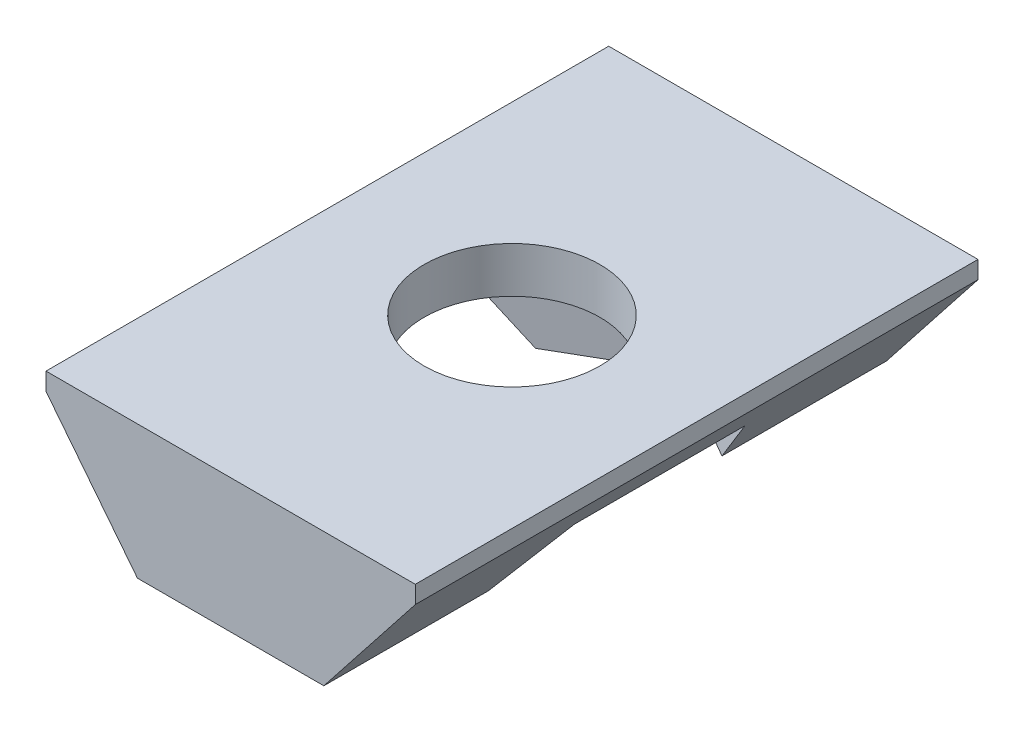
ISO-10303-21;
HEADER;
FILE_DESCRIPTION(('STEP AP214'),'2;1');
FILE_NAME('part.step','',(''),(''),'','','');
FILE_SCHEMA(('AUTOMOTIVE_DESIGN { 1 0 10303 214 1 1 1 1 }'));
ENDSEC;
DATA;
#1=APPLICATION_CONTEXT('core data for automotive mechanical design processes');
#2=APPLICATION_PROTOCOL_DEFINITION('international standard','automotive_design',2000,#1);
#3=PRODUCT_CONTEXT('',#1,'mechanical');
#4=PRODUCT('Part','Part','',(#3));
#5=PRODUCT_RELATED_PRODUCT_CATEGORY('part','',(#4));
#6=PRODUCT_DEFINITION_FORMATION('','',#4);
#7=PRODUCT_DEFINITION_CONTEXT('part definition',#1,'design');
#8=PRODUCT_DEFINITION('design','',#6,#7);
#9=PRODUCT_DEFINITION_SHAPE('','',#8);
#10=(LENGTH_UNIT() NAMED_UNIT(*) SI_UNIT(.MILLI.,.METRE.));
#11=(NAMED_UNIT(*) PLANE_ANGLE_UNIT() SI_UNIT($,.RADIAN.));
#12=(NAMED_UNIT(*) SI_UNIT($,.STERADIAN.) SOLID_ANGLE_UNIT());
#13=UNCERTAINTY_MEASURE_WITH_UNIT(LENGTH_MEASURE(1.E-05),#10,'distance_accuracy_value','');
#14=(GEOMETRIC_REPRESENTATION_CONTEXT(3) GLOBAL_UNCERTAINTY_ASSIGNED_CONTEXT((#13)) GLOBAL_UNIT_ASSIGNED_CONTEXT((#10,
#11,#12)) REPRESENTATION_CONTEXT('',''));
#15=CARTESIAN_POINT('',(0.,0.,0.));
#16=DIRECTION('',(0.,0.,1.));
#17=DIRECTION('',(1.,0.,0.));
#18=AXIS2_PLACEMENT_3D('',#15,#16,#17);
#19=CARTESIAN_POINT('',(-2.65,0.,16.));
#20=DIRECTION('',(0.,1.,0.));
#21=DIRECTION('',(-1.,0.,0.));
#22=AXIS2_PLACEMENT_3D('',#19,#20,#21);
#23=PLANE('',#22);
#24=DIRECTION('',(0.,0.,-1.));
#25=VECTOR('',#24,1.);
#26=CARTESIAN_POINT('',(2.65,0.,16.));
#27=LINE('',#26,#25);
#28=CARTESIAN_POINT('',(2.65,0.,4.68023595215965));
#29=VERTEX_POINT('',#28);
#30=CARTESIAN_POINT('',(2.65,0.,0.));
#31=VERTEX_POINT('',#30);
#32=EDGE_CURVE('E148',#29,#31,#27,.T.);
#33=ORIENTED_EDGE('',*,*,#32,.F.);
#34=DIRECTION('',(0.866025403784439,0.,0.5));
#35=VECTOR('',#34,1.);
#36=CARTESIAN_POINT('',(0.,0.,3.15025773880714));
#37=LINE('',#36,#35);
#38=CARTESIAN_POINT('',(0.,0.,3.15025773880714));
#39=VERTEX_POINT('',#38);
#40=EDGE_CURVE('E49',#39,#29,#37,.T.);
#41=ORIENTED_EDGE('',*,*,#40,.F.);
#42=DIRECTION('',(0.866025403784439,0.,-0.5));
#43=VECTOR('',#42,1.);
#44=CARTESIAN_POINT('',(-4.2,0.,5.57512886940357));
#45=LINE('',#44,#43);
#46=CARTESIAN_POINT('',(-2.65,0.,4.68023595215965));
#47=VERTEX_POINT('',#46);
#48=EDGE_CURVE('E196',#47,#39,#45,.T.);
#49=ORIENTED_EDGE('',*,*,#48,.F.);
#50=DIRECTION('',(0.,0.,-1.));
#51=VECTOR('',#50,1.);
#52=CARTESIAN_POINT('',(-2.65,0.,16.));
#53=LINE('',#52,#51);
#54=CARTESIAN_POINT('',(-2.65,0.,0.));
#55=VERTEX_POINT('',#54);
#56=EDGE_CURVE('E152',#47,#55,#53,.T.);
#57=ORIENTED_EDGE('',*,*,#56,.T.);
#58=DIRECTION('',(1.,0.,0.));
#59=VECTOR('',#58,1.);
#60=CARTESIAN_POINT('',(-2.65,0.,0.));
#61=LINE('',#60,#59);
#62=EDGE_CURVE('E134',#55,#31,#61,.T.);
#63=ORIENTED_EDGE('',*,*,#62,.T.);
#64=EDGE_LOOP('',(#33,#41,#49,#57,#63));
#65=FACE_BOUND('',#64,.T.);
#66=ADVANCED_FACE('F34',(#65),#23,.F.);
#67=CARTESIAN_POINT('',(0.,0.,8.));
#68=DIRECTION('',(0.,1.,0.));
#69=DIRECTION('',(0.,0.,1.));
#70=AXIS2_PLACEMENT_3D('',#67,#68,#69);
#71=CYLINDRICAL_SURFACE('',#70,2.5);
#72=CARTESIAN_POINT('',(0.,3.8,8.));
#73=DIRECTION('',(0.,-1.,0.));
#74=DIRECTION('',(0.,0.,-1.));
#75=AXIS2_PLACEMENT_3D('',#72,#73,#74);
#76=CIRCLE('',#75,2.5);
#77=CARTESIAN_POINT('',(0.,3.8,10.5));
#78=VERTEX_POINT('',#77);
#79=EDGE_CURVE('E135',#78,#78,#76,.T.);
#80=CARTESIAN_POINT('',(0.,2.5,8.));
#81=DIRECTION('',(0.,-1.,0.));
#82=DIRECTION('',(1.,0.,0.));
#83=AXIS2_PLACEMENT_3D('',#80,#81,#82);
#84=CIRCLE('',#83,2.5);
#85=CARTESIAN_POINT('',(0.,2.5,10.5));
#86=VERTEX_POINT('',#85);
#87=EDGE_CURVE('E159',#86,#86,#84,.F.);
#88=CARTESIAN_POINT('',(0.,3.8,10.5));
#89=CARTESIAN_POINT('',(0.,3.78645833333333,10.5));
#90=CARTESIAN_POINT('',(0.,3.77291666666667,10.5));
#91=CARTESIAN_POINT('',(0.,3.74583333333333,10.5));
#92=CARTESIAN_POINT('',(0.,3.73229166666667,10.5));
#93=CARTESIAN_POINT('',(0.,3.70520833333333,10.5));
#94=CARTESIAN_POINT('',(0.,3.69166666666667,10.5));
#95=CARTESIAN_POINT('',(0.,3.66458333333333,10.5));
#96=CARTESIAN_POINT('',(0.,3.65104166666667,10.5));
#97=CARTESIAN_POINT('',(0.,3.62395833333333,10.5));
#98=CARTESIAN_POINT('',(0.,3.61041666666667,10.5));
#99=CARTESIAN_POINT('',(0.,3.58333333333333,10.5));
#100=CARTESIAN_POINT('',(0.,3.56979166666667,10.5));
#101=CARTESIAN_POINT('',(0.,3.54270833333333,10.5));
#102=CARTESIAN_POINT('',(0.,3.52916666666667,10.5));
#103=CARTESIAN_POINT('',(0.,3.50208333333333,10.5));
#104=CARTESIAN_POINT('',(0.,3.48854166666667,10.5));
#105=CARTESIAN_POINT('',(0.,3.46145833333333,10.5));
#106=CARTESIAN_POINT('',(0.,3.44791666666667,10.5));
#107=CARTESIAN_POINT('',(0.,3.42083333333333,10.5));
#108=CARTESIAN_POINT('',(0.,3.40729166666667,10.5));
#109=CARTESIAN_POINT('',(0.,3.38020833333333,10.5));
#110=CARTESIAN_POINT('',(0.,3.36666666666667,10.5));
#111=CARTESIAN_POINT('',(0.,3.33958333333333,10.5));
#112=CARTESIAN_POINT('',(0.,3.32604166666667,10.5));
#113=CARTESIAN_POINT('',(0.,3.29895833333333,10.5));
#114=CARTESIAN_POINT('',(0.,3.28541666666667,10.5));
#115=CARTESIAN_POINT('',(0.,3.25833333333333,10.5));
#116=CARTESIAN_POINT('',(0.,3.24479166666667,10.5));
#117=CARTESIAN_POINT('',(0.,3.21770833333333,10.5));
#118=CARTESIAN_POINT('',(0.,3.20416666666667,10.5));
#119=CARTESIAN_POINT('',(0.,3.17708333333333,10.5));
#120=CARTESIAN_POINT('',(0.,3.16354166666667,10.5));
#121=CARTESIAN_POINT('',(0.,3.13645833333333,10.5));
#122=CARTESIAN_POINT('',(0.,3.12291666666667,10.5));
#123=CARTESIAN_POINT('',(0.,3.09583333333333,10.5));
#124=CARTESIAN_POINT('',(0.,3.08229166666667,10.5));
#125=CARTESIAN_POINT('',(0.,3.05520833333333,10.5));
#126=CARTESIAN_POINT('',(0.,3.04166666666667,10.5));
#127=CARTESIAN_POINT('',(0.,3.01458333333333,10.5));
#128=CARTESIAN_POINT('',(0.,3.00104166666667,10.5));
#129=CARTESIAN_POINT('',(0.,2.97395833333333,10.5));
#130=CARTESIAN_POINT('',(0.,2.96041666666667,10.5));
#131=CARTESIAN_POINT('',(0.,2.93333333333333,10.5));
#132=CARTESIAN_POINT('',(0.,2.91979166666667,10.5));
#133=CARTESIAN_POINT('',(0.,2.89270833333333,10.5));
#134=CARTESIAN_POINT('',(0.,2.87916666666667,10.5));
#135=CARTESIAN_POINT('',(0.,2.85208333333333,10.5));
#136=CARTESIAN_POINT('',(0.,2.83854166666667,10.5));
#137=CARTESIAN_POINT('',(0.,2.81145833333333,10.5));
#138=CARTESIAN_POINT('',(0.,2.79791666666667,10.5));
#139=CARTESIAN_POINT('',(0.,2.77083333333333,10.5));
#140=CARTESIAN_POINT('',(0.,2.75729166666667,10.5));
#141=CARTESIAN_POINT('',(0.,2.73020833333333,10.5));
#142=CARTESIAN_POINT('',(0.,2.71666666666667,10.5));
#143=CARTESIAN_POINT('',(0.,2.68958333333333,10.5));
#144=CARTESIAN_POINT('',(0.,2.67604166666667,10.5));
#145=CARTESIAN_POINT('',(0.,2.64895833333333,10.5));
#146=CARTESIAN_POINT('',(0.,2.63541666666667,10.5));
#147=CARTESIAN_POINT('',(0.,2.60833333333333,10.5));
#148=CARTESIAN_POINT('',(0.,2.59479166666667,10.5));
#149=CARTESIAN_POINT('',(0.,2.56770833333333,10.5));
#150=CARTESIAN_POINT('',(0.,2.55416666666667,10.5));
#151=CARTESIAN_POINT('',(0.,2.52708333333333,10.5));
#152=CARTESIAN_POINT('',(0.,2.51354166666667,10.5));
#153=CARTESIAN_POINT('',(0.,2.5,10.5));
#154=B_SPLINE_CURVE_WITH_KNOTS('',3,(#88,#89,#90,#91,#92,#93,#94,#95,#96,#97,#98,#99,#100,#101,
#102,#103,#104,#105,#106,#107,#108,#109,#110,#111,#112,#113,#114,#115,#116,#117,#118,#119,#120,
#121,#122,#123,#124,#125,#126,#127,#128,#129,#130,#131,#132,#133,#134,#135,#136,#137,#138,#139,
#140,#141,#142,#143,#144,#145,#146,#147,#148,#149,#150,#151,#152,#153),.UNSPECIFIED.,.F.,.F.,(4,
2,2,2,2,2,2,2,2,2,2,2,2,2,2,2,2,2,2,2,2,2,2,2,2,2,2,2,2,2,2,2,4),(0.,0.0406249999999999,
0.0812500000000002,0.121875,0.1625,0.203125,0.24375,0.284375,0.325,0.365625,0.40625,0.446875,
0.4875,0.528125,0.56875,0.609375,0.65,0.690625,0.73125,0.771875,0.8125,0.853125,0.89375,
0.934375,0.975,1.015625,1.05625,1.096875,1.1375,1.178125,1.21875,1.259375,1.3),.UNSPECIFIED.);
#155=EDGE_CURVE('BSEAM303',#78,#86,#154,.T.);
#156=ORIENTED_EDGE('',*,*,#79,.F.);
#157=ORIENTED_EDGE('',*,*,#87,.F.);
#158=ORIENTED_EDGE('',*,*,#155,.T.);
#159=ORIENTED_EDGE('',*,*,#155,.F.);
#160=EDGE_LOOP('',(#156,#158,#157,#159));
#161=FACE_BOUND('',#160,.T.);
#162=ADVANCED_FACE('F303',(#161),#71,.F.);
#163=CARTESIAN_POINT('',(-2.65,0.,16.));
#164=DIRECTION('',(0.785491672227536,0.618872226603513,0.));
#165=DIRECTION('',(-0.618872226603513,0.785491672227536,0.));
#166=AXIS2_PLACEMENT_3D('',#163,#164,#165);
#167=PLANE('',#166);
#168=ORIENTED_EDGE('',*,*,#56,.F.);
#169=DIRECTION('',(-0.582787783907528,0.739692187267247,0.336472683919436));
#170=VECTOR('',#169,1.);
#171=CARTESIAN_POINT('',(-4.86971709384232,2.81733323449217,5.96179021381433));
#172=LINE('',#171,#170);
#173=CARTESIAN_POINT('',(-4.2,1.96730769230769,5.57512886940357));
#174=VERTEX_POINT('',#173);
#175=EDGE_CURVE('E158',#47,#174,#172,.T.);
#176=ORIENTED_EDGE('',*,*,#175,.T.);
#177=DIRECTION('',(0.,0.,1.));
#178=VECTOR('',#177,1.);
#179=CARTESIAN_POINT('',(-4.2,1.96730769230769,16.));
#180=LINE('',#179,#178);
#181=CARTESIAN_POINT('',(-4.2,1.96730769230769,10.4248711305964));
#182=VERTEX_POINT('',#181);
#183=EDGE_CURVE('E11',#174,#182,#180,.T.);
#184=ORIENTED_EDGE('',*,*,#183,.T.);
#185=DIRECTION('',(0.582787783907528,-0.739692187267247,0.336472683919437));
#186=VECTOR('',#185,1.);
#187=CARTESIAN_POINT('',(-1.7322423769331,-1.16484621389261,11.8496316585689));
#188=LINE('',#187,#186);
#189=CARTESIAN_POINT('',(-2.65,0.,11.3197640478403));
#190=VERTEX_POINT('',#189);
#191=EDGE_CURVE('E162',#182,#190,#188,.T.);
#192=ORIENTED_EDGE('',*,*,#191,.T.);
#193=CARTESIAN_POINT('',(-2.65,0.,16.));
#194=VERTEX_POINT('',#193);
#195=EDGE_CURVE('E153',#194,#190,#53,.T.);
#196=ORIENTED_EDGE('',*,*,#195,.F.);
#197=DIRECTION('',(0.618872226603513,-0.785491672227536,0.));
#198=VECTOR('',#197,1.);
#199=CARTESIAN_POINT('',(-2.65,0.,16.));
#200=LINE('',#199,#198);
#201=CARTESIAN_POINT('',(-5.25,3.3,16.));
#202=VERTEX_POINT('',#201);
#203=EDGE_CURVE('E144',#202,#194,#200,.T.);
#204=ORIENTED_EDGE('',*,*,#203,.F.);
#205=DIRECTION('',(0.,0.,-1.));
#206=VECTOR('',#205,1.);
#207=CARTESIAN_POINT('',(-5.25,3.3,16.));
#208=LINE('',#207,#206);
#209=CARTESIAN_POINT('',(-5.25,3.3,0.));
#210=VERTEX_POINT('',#209);
#211=EDGE_CURVE('E127',#202,#210,#208,.T.);
#212=ORIENTED_EDGE('',*,*,#211,.T.);
#213=DIRECTION('',(0.618872226603513,-0.785491672227536,0.));
#214=VECTOR('',#213,1.);
#215=CARTESIAN_POINT('',(-2.65,0.,0.));
#216=LINE('',#215,#214);
#217=EDGE_CURVE('E131',#210,#55,#216,.T.);
#218=ORIENTED_EDGE('',*,*,#217,.T.);
#219=EDGE_LOOP('',(#168,#176,#184,#192,#196,#204,#212,#218));
#220=FACE_BOUND('',#219,.T.);
#221=ADVANCED_FACE('F36',(#220),#167,.F.);
#222=DIRECTION('',(-0.866025403784438,0.,-0.5));
#223=VECTOR('',#222,1.);
#224=CARTESIAN_POINT('',(0.,0.,12.8497422611929));
#225=LINE('',#224,#223);
#226=CARTESIAN_POINT('',(0.,0.,12.8497422611929));
#227=VERTEX_POINT('',#226);
#228=EDGE_CURVE('E194',#227,#190,#225,.T.);
#229=ORIENTED_EDGE('',*,*,#228,.F.);
#230=DIRECTION('',(-0.866025403784439,0.,0.5));
#231=VECTOR('',#230,1.);
#232=CARTESIAN_POINT('',(4.2,0.,10.4248711305964));
#233=LINE('',#232,#231);
#234=CARTESIAN_POINT('',(2.65,0.,11.3197640478404));
#235=VERTEX_POINT('',#234);
#236=EDGE_CURVE('E184',#235,#227,#233,.T.);
#237=ORIENTED_EDGE('',*,*,#236,.F.);
#238=CARTESIAN_POINT('',(2.65,0.,16.));
#239=VERTEX_POINT('',#238);
#240=EDGE_CURVE('E149',#239,#235,#27,.T.);
#241=ORIENTED_EDGE('',*,*,#240,.F.);
#242=DIRECTION('',(1.,0.,0.));
#243=VECTOR('',#242,1.);
#244=CARTESIAN_POINT('',(-2.65,0.,16.));
#245=LINE('',#244,#243);
#246=EDGE_CURVE('E94',#194,#239,#245,.T.);
#247=ORIENTED_EDGE('',*,*,#246,.F.);
#248=ORIENTED_EDGE('',*,*,#195,.T.);
#249=EDGE_LOOP('',(#229,#237,#241,#247,#248));
#250=FACE_BOUND('',#249,.T.);
#251=ADVANCED_FACE('F192',(#250),#23,.F.);
#252=CARTESIAN_POINT('',(5.25,3.3,16.));
#253=DIRECTION('',(-0.785491672227536,0.618872226603513,0.));
#254=DIRECTION('',(-0.618872226603513,-0.785491672227535,0.));
#255=AXIS2_PLACEMENT_3D('',#252,#253,#254);
#256=PLANE('',#255);
#257=ORIENTED_EDGE('',*,*,#240,.T.);
#258=DIRECTION('',(0.582787783907528,0.739692187267247,-0.336472683919437));
#259=VECTOR('',#258,1.);
#260=CARTESIAN_POINT('',(4.03788632267083,1.76154802492836,10.5184675058417));
#261=LINE('',#260,#259);
#262=CARTESIAN_POINT('',(4.2,1.96730769230769,10.4248711305964));
#263=VERTEX_POINT('',#262);
#264=EDGE_CURVE('E42',#235,#263,#261,.T.);
#265=ORIENTED_EDGE('',*,*,#264,.T.);
#266=DIRECTION('',(0.,0.,-1.));
#267=VECTOR('',#266,1.);
#268=CARTESIAN_POINT('',(4.2,1.96730769230769,16.));
#269=LINE('',#268,#267);
#270=CARTESIAN_POINT('',(4.2,1.96730769230769,5.57512886940358));
#271=VERTEX_POINT('',#270);
#272=EDGE_CURVE('E165',#263,#271,#269,.T.);
#273=ORIENTED_EDGE('',*,*,#272,.T.);
#274=DIRECTION('',(-0.582787783907528,-0.739692187267247,-0.336472683919437));
#275=VECTOR('',#274,1.);
#276=CARTESIAN_POINT('',(7.17536103958005,5.74372747331314,7.29295436654145));
#277=LINE('',#276,#275);
#278=EDGE_CURVE('E155',#271,#29,#277,.T.);
#279=ORIENTED_EDGE('',*,*,#278,.T.);
#280=ORIENTED_EDGE('',*,*,#32,.T.);
#281=DIRECTION('',(0.618872226603513,0.785491672227535,0.));
#282=VECTOR('',#281,1.);
#283=CARTESIAN_POINT('',(5.25,3.3,0.));
#284=LINE('',#283,#282);
#285=CARTESIAN_POINT('',(5.25,3.3,0.));
#286=VERTEX_POINT('',#285);
#287=EDGE_CURVE('E138',#31,#286,#284,.T.);
#288=ORIENTED_EDGE('',*,*,#287,.T.);
#289=DIRECTION('',(0.,0.,-1.));
#290=VECTOR('',#289,1.);
#291=CARTESIAN_POINT('',(5.25,3.3,16.));
#292=LINE('',#291,#290);
#293=CARTESIAN_POINT('',(5.25,3.3,16.));
#294=VERTEX_POINT('',#293);
#295=EDGE_CURVE('E122',#294,#286,#292,.T.);
#296=ORIENTED_EDGE('',*,*,#295,.F.);
#297=DIRECTION('',(0.618872226603513,0.785491672227535,0.));
#298=VECTOR('',#297,1.);
#299=CARTESIAN_POINT('',(5.25,3.3,16.));
#300=LINE('',#299,#298);
#301=EDGE_CURVE('E110',#239,#294,#300,.T.);
#302=ORIENTED_EDGE('',*,*,#301,.F.);
#303=EDGE_LOOP('',(#257,#265,#273,#279,#280,#288,#296,#302));
#304=FACE_BOUND('',#303,.T.);
#305=ADVANCED_FACE('F171',(#304),#256,.F.);
#306=CARTESIAN_POINT('',(5.25,3.3,16.));
#307=DIRECTION('',(-1.,0.,0.));
#308=DIRECTION('',(0.,-1.,0.));
#309=AXIS2_PLACEMENT_3D('',#306,#307,#308);
#310=PLANE('',#309);
#311=DIRECTION('',(0.,1.,0.));
#312=VECTOR('',#311,1.);
#313=CARTESIAN_POINT('',(5.25,3.3,0.));
#314=LINE('',#313,#312);
#315=CARTESIAN_POINT('',(5.25,3.8,0.));
#316=VERTEX_POINT('',#315);
#317=EDGE_CURVE('E119',#286,#316,#314,.T.);
#318=ORIENTED_EDGE('',*,*,#317,.T.);
#319=DIRECTION('',(0.,0.,-1.));
#320=VECTOR('',#319,1.);
#321=CARTESIAN_POINT('',(5.25,3.8,16.));
#322=LINE('',#321,#320);
#323=CARTESIAN_POINT('',(5.25,3.8,16.));
#324=VERTEX_POINT('',#323);
#325=EDGE_CURVE('E116',#324,#316,#322,.T.);
#326=ORIENTED_EDGE('',*,*,#325,.F.);
#327=DIRECTION('',(0.,1.,0.));
#328=VECTOR('',#327,1.);
#329=CARTESIAN_POINT('',(5.25,3.3,16.));
#330=LINE('',#329,#328);
#331=EDGE_CURVE('E103',#294,#324,#330,.T.);
#332=ORIENTED_EDGE('',*,*,#331,.F.);
#333=ORIENTED_EDGE('',*,*,#295,.T.);
#334=EDGE_LOOP('',(#318,#326,#332,#333));
#335=FACE_BOUND('',#334,.T.);
#336=ADVANCED_FACE('F117',(#335),#310,.F.);
#337=CARTESIAN_POINT('',(-5.25,3.8,16.));
#338=DIRECTION('',(0.,-1.,0.));
#339=DIRECTION('',(0.,0.,-1.));
#340=AXIS2_PLACEMENT_3D('',#337,#338,#339);
#341=PLANE('',#340);
#342=ORIENTED_EDGE('',*,*,#79,.T.);
#343=EDGE_LOOP('',(#342));
#344=FACE_BOUND('',#343,.T.);
#345=DIRECTION('',(-1.,0.,0.));
#346=VECTOR('',#345,1.);
#347=CARTESIAN_POINT('',(-5.25,3.8,0.));
#348=LINE('',#347,#346);
#349=CARTESIAN_POINT('',(-5.25,3.8,0.));
#350=VERTEX_POINT('',#349);
#351=EDGE_CURVE('E141',#316,#350,#348,.T.);
#352=ORIENTED_EDGE('',*,*,#351,.T.);
#353=DIRECTION('',(0.,0.,-1.));
#354=VECTOR('',#353,1.);
#355=CARTESIAN_POINT('',(-5.25,3.8,16.));
#356=LINE('',#355,#354);
#357=CARTESIAN_POINT('',(-5.25,3.8,16.));
#358=VERTEX_POINT('',#357);
#359=EDGE_CURVE('E123',#358,#350,#356,.T.);
#360=ORIENTED_EDGE('',*,*,#359,.F.);
#361=DIRECTION('',(-1.,0.,0.));
#362=VECTOR('',#361,1.);
#363=CARTESIAN_POINT('',(-5.25,3.8,16.));
#364=LINE('',#363,#362);
#365=EDGE_CURVE('E107',#324,#358,#364,.T.);
#366=ORIENTED_EDGE('',*,*,#365,.F.);
#367=ORIENTED_EDGE('',*,*,#325,.T.);
#368=EDGE_LOOP('',(#352,#360,#366,#367));
#369=FACE_BOUND('',#368,.T.);
#370=ADVANCED_FACE('F125',(#344,#369),#341,.F.);
#371=CARTESIAN_POINT('',(-5.25,3.3,16.));
#372=DIRECTION('',(1.,0.,0.));
#373=DIRECTION('',(0.,1.,0.));
#374=AXIS2_PLACEMENT_3D('',#371,#372,#373);
#375=PLANE('',#374);
#376=DIRECTION('',(0.,-1.,0.));
#377=VECTOR('',#376,1.);
#378=CARTESIAN_POINT('',(-5.25,3.3,0.));
#379=LINE('',#378,#377);
#380=EDGE_CURVE('E85',#350,#210,#379,.T.);
#381=ORIENTED_EDGE('',*,*,#380,.T.);
#382=ORIENTED_EDGE('',*,*,#211,.F.);
#383=DIRECTION('',(0.,-1.,0.));
#384=VECTOR('',#383,1.);
#385=CARTESIAN_POINT('',(-5.25,3.3,16.));
#386=LINE('',#385,#384);
#387=EDGE_CURVE('E58',#358,#202,#386,.T.);
#388=ORIENTED_EDGE('',*,*,#387,.F.);
#389=ORIENTED_EDGE('',*,*,#359,.T.);
#390=EDGE_LOOP('',(#381,#382,#388,#389));
#391=FACE_BOUND('',#390,.T.);
#392=ADVANCED_FACE('F336',(#391),#375,.F.);
#393=CARTESIAN_POINT('',(0.,0.,16.));
#394=DIRECTION('',(0.,0.,1.));
#395=DIRECTION('',(1.,0.,0.));
#396=AXIS2_PLACEMENT_3D('',#393,#394,#395);
#397=PLANE('',#396);
#398=ORIENTED_EDGE('',*,*,#203,.T.);
#399=ORIENTED_EDGE('',*,*,#246,.T.);
#400=ORIENTED_EDGE('',*,*,#301,.T.);
#401=ORIENTED_EDGE('',*,*,#331,.T.);
#402=ORIENTED_EDGE('',*,*,#365,.T.);
#403=ORIENTED_EDGE('',*,*,#387,.T.);
#404=EDGE_LOOP('',(#398,#399,#400,#401,#402,#403));
#405=FACE_BOUND('',#404,.T.);
#406=ADVANCED_FACE('F105',(#405),#397,.T.);
#407=CARTESIAN_POINT('',(0.,0.,0.));
#408=DIRECTION('',(0.,0.,1.));
#409=DIRECTION('',(1.,0.,0.));
#410=AXIS2_PLACEMENT_3D('',#407,#408,#409);
#411=PLANE('',#410);
#412=ORIENTED_EDGE('',*,*,#217,.F.);
#413=ORIENTED_EDGE('',*,*,#380,.F.);
#414=ORIENTED_EDGE('',*,*,#351,.F.);
#415=ORIENTED_EDGE('',*,*,#317,.F.);
#416=ORIENTED_EDGE('',*,*,#287,.F.);
#417=ORIENTED_EDGE('',*,*,#62,.F.);
#418=EDGE_LOOP('',(#412,#413,#414,#415,#416,#417));
#419=FACE_BOUND('',#418,.T.);
#420=ADVANCED_FACE('F258',(#419),#411,.F.);
#421=CARTESIAN_POINT('',(-4.2,2.5,10.4248711305964));
#422=DIRECTION('',(-1.,0.,0.));
#423=DIRECTION('',(0.,-1.,0.));
#424=AXIS2_PLACEMENT_3D('',#421,#422,#423);
#425=PLANE('',#424);
#426=DIRECTION('',(0.,-1.,0.));
#427=VECTOR('',#426,1.);
#428=CARTESIAN_POINT('',(-4.2,2.5,5.57512886940357));
#429=LINE('',#428,#427);
#430=CARTESIAN_POINT('',(-4.2,2.5,5.57512886940357));
#431=VERTEX_POINT('',#430);
#432=EDGE_CURVE('E212',#431,#174,#429,.T.);
#433=ORIENTED_EDGE('',*,*,#432,.F.);
#434=DIRECTION('',(0.,0.,-1.));
#435=VECTOR('',#434,1.);
#436=CARTESIAN_POINT('',(-4.2,2.5,10.4248711305964));
#437=LINE('',#436,#435);
#438=CARTESIAN_POINT('',(-4.2,2.5,10.4248711305964));
#439=VERTEX_POINT('',#438);
#440=EDGE_CURVE('E277',#439,#431,#437,.T.);
#441=ORIENTED_EDGE('',*,*,#440,.F.);
#442=DIRECTION('',(0.,-1.,0.));
#443=VECTOR('',#442,1.);
#444=CARTESIAN_POINT('',(-4.2,2.5,10.4248711305964));
#445=LINE('',#444,#443);
#446=EDGE_CURVE('E215',#439,#182,#445,.T.);
#447=ORIENTED_EDGE('',*,*,#446,.T.);
#448=ORIENTED_EDGE('',*,*,#183,.F.);
#449=EDGE_LOOP('',(#433,#441,#447,#448));
#450=FACE_BOUND('',#449,.T.);
#451=ADVANCED_FACE('F241',(#450),#425,.F.);
#452=CARTESIAN_POINT('',(-4.2,2.5,5.57512886940357));
#453=DIRECTION('',(-0.5,0.,-0.866025403784439));
#454=DIRECTION('',(-0.866025403784439,0.,0.5));
#455=AXIS2_PLACEMENT_3D('',#452,#453,#454);
#456=PLANE('',#455);
#457=ORIENTED_EDGE('',*,*,#48,.T.);
#458=DIRECTION('',(0.,-1.,0.));
#459=VECTOR('',#458,1.);
#460=CARTESIAN_POINT('',(0.,2.5,3.15025773880714));
#461=LINE('',#460,#459);
#462=CARTESIAN_POINT('',(0.,2.5,3.15025773880714));
#463=VERTEX_POINT('',#462);
#464=EDGE_CURVE('E210',#463,#39,#461,.T.);
#465=ORIENTED_EDGE('',*,*,#464,.F.);
#466=DIRECTION('',(0.866025403784439,0.,-0.5));
#467=VECTOR('',#466,1.);
#468=CARTESIAN_POINT('',(-4.2,2.5,5.57512886940357));
#469=LINE('',#468,#467);
#470=EDGE_CURVE('E250',#431,#463,#469,.T.);
#471=ORIENTED_EDGE('',*,*,#470,.F.);
#472=ORIENTED_EDGE('',*,*,#432,.T.);
#473=ORIENTED_EDGE('',*,*,#175,.F.);
#474=EDGE_LOOP('',(#457,#465,#471,#472,#473));
#475=FACE_BOUND('',#474,.T.);
#476=ADVANCED_FACE('F246',(#475),#456,.F.);
#477=CARTESIAN_POINT('',(0.,2.5,12.8497422611929));
#478=DIRECTION('',(-0.5,0.,0.866025403784438));
#479=DIRECTION('',(0.866025403784439,0.,0.5));
#480=AXIS2_PLACEMENT_3D('',#477,#478,#479);
#481=PLANE('',#480);
#482=ORIENTED_EDGE('',*,*,#446,.F.);
#483=DIRECTION('',(-0.866025403784438,0.,-0.5));
#484=VECTOR('',#483,1.);
#485=CARTESIAN_POINT('',(0.,2.5,12.8497422611929));
#486=LINE('',#485,#484);
#487=CARTESIAN_POINT('',(0.,2.5,12.8497422611929));
#488=VERTEX_POINT('',#487);
#489=EDGE_CURVE('E275',#488,#439,#486,.T.);
#490=ORIENTED_EDGE('',*,*,#489,.F.);
#491=DIRECTION('',(0.,-1.,0.));
#492=VECTOR('',#491,1.);
#493=CARTESIAN_POINT('',(0.,2.5,12.8497422611929));
#494=LINE('',#493,#492);
#495=EDGE_CURVE('E218',#488,#227,#494,.T.);
#496=ORIENTED_EDGE('',*,*,#495,.T.);
#497=ORIENTED_EDGE('',*,*,#228,.T.);
#498=ORIENTED_EDGE('',*,*,#191,.F.);
#499=EDGE_LOOP('',(#482,#490,#496,#497,#498));
#500=FACE_BOUND('',#499,.T.);
#501=ADVANCED_FACE('F273',(#500),#481,.F.);
#502=CARTESIAN_POINT('',(4.2,2.5,10.4248711305964));
#503=DIRECTION('',(0.5,0.,0.866025403784439));
#504=DIRECTION('',(0.866025403784439,0.,-0.5));
#505=AXIS2_PLACEMENT_3D('',#502,#503,#504);
#506=PLANE('',#505);
#507=ORIENTED_EDGE('',*,*,#236,.T.);
#508=ORIENTED_EDGE('',*,*,#495,.F.);
#509=DIRECTION('',(-0.866025403784439,0.,0.5));
#510=VECTOR('',#509,1.);
#511=CARTESIAN_POINT('',(4.2,2.5,10.4248711305964));
#512=LINE('',#511,#510);
#513=CARTESIAN_POINT('',(4.2,2.5,10.4248711305964));
#514=VERTEX_POINT('',#513);
#515=EDGE_CURVE('E205',#514,#488,#512,.T.);
#516=ORIENTED_EDGE('',*,*,#515,.F.);
#517=DIRECTION('',(0.,-1.,0.));
#518=VECTOR('',#517,1.);
#519=CARTESIAN_POINT('',(4.2,2.5,10.4248711305964));
#520=LINE('',#519,#518);
#521=EDGE_CURVE('E163',#514,#263,#520,.T.);
#522=ORIENTED_EDGE('',*,*,#521,.T.);
#523=ORIENTED_EDGE('',*,*,#264,.F.);
#524=EDGE_LOOP('',(#507,#508,#516,#522,#523));
#525=FACE_BOUND('',#524,.T.);
#526=ADVANCED_FACE('F181',(#525),#506,.F.);
#527=CARTESIAN_POINT('',(4.2,2.5,5.57512886940357));
#528=DIRECTION('',(1.,0.,0.));
#529=DIRECTION('',(0.,0.,-1.));
#530=AXIS2_PLACEMENT_3D('',#527,#528,#529);
#531=PLANE('',#530);
#532=ORIENTED_EDGE('',*,*,#521,.F.);
#533=DIRECTION('',(0.,0.,1.));
#534=VECTOR('',#533,1.);
#535=CARTESIAN_POINT('',(4.2,2.5,5.57512886940357));
#536=LINE('',#535,#534);
#537=CARTESIAN_POINT('',(4.2,2.5,5.57512886940357));
#538=VERTEX_POINT('',#537);
#539=EDGE_CURVE('E199',#538,#514,#536,.T.);
#540=ORIENTED_EDGE('',*,*,#539,.F.);
#541=DIRECTION('',(0.,-1.,0.));
#542=VECTOR('',#541,1.);
#543=CARTESIAN_POINT('',(4.2,2.5,5.57512886940357));
#544=LINE('',#543,#542);
#545=EDGE_CURVE('E207',#538,#271,#544,.T.);
#546=ORIENTED_EDGE('',*,*,#545,.T.);
#547=ORIENTED_EDGE('',*,*,#272,.F.);
#548=EDGE_LOOP('',(#532,#540,#546,#547));
#549=FACE_BOUND('',#548,.T.);
#550=ADVANCED_FACE('F291',(#549),#531,.F.);
#551=CARTESIAN_POINT('',(0.,2.5,3.15025773880714));
#552=DIRECTION('',(0.5,0.,-0.866025403784438));
#553=DIRECTION('',(-0.866025403784438,0.,-0.5));
#554=AXIS2_PLACEMENT_3D('',#551,#552,#553);
#555=PLANE('',#554);
#556=ORIENTED_EDGE('',*,*,#545,.F.);
#557=DIRECTION('',(0.866025403784439,0.,0.5));
#558=VECTOR('',#557,1.);
#559=CARTESIAN_POINT('',(0.,2.5,3.15025773880714));
#560=LINE('',#559,#558);
#561=EDGE_CURVE('E286',#463,#538,#560,.T.);
#562=ORIENTED_EDGE('',*,*,#561,.F.);
#563=ORIENTED_EDGE('',*,*,#464,.T.);
#564=ORIENTED_EDGE('',*,*,#40,.T.);
#565=ORIENTED_EDGE('',*,*,#278,.F.);
#566=EDGE_LOOP('',(#556,#562,#563,#564,#565));
#567=FACE_BOUND('',#566,.T.);
#568=ADVANCED_FACE('F292',(#567),#555,.F.);
#569=CARTESIAN_POINT('',(0.,2.5,0.));
#570=DIRECTION('',(0.,-1.,0.));
#571=DIRECTION('',(1.,0.,0.));
#572=AXIS2_PLACEMENT_3D('',#569,#570,#571);
#573=PLANE('',#572);
#574=ORIENTED_EDGE('',*,*,#515,.T.);
#575=ORIENTED_EDGE('',*,*,#489,.T.);
#576=ORIENTED_EDGE('',*,*,#440,.T.);
#577=ORIENTED_EDGE('',*,*,#470,.T.);
#578=ORIENTED_EDGE('',*,*,#561,.T.);
#579=ORIENTED_EDGE('',*,*,#539,.T.);
#580=EDGE_LOOP('',(#574,#575,#576,#577,#578,#579));
#581=FACE_BOUND('',#580,.T.);
#582=ORIENTED_EDGE('',*,*,#87,.T.);
#583=EDGE_LOOP('',(#582));
#584=FACE_BOUND('',#583,.T.);
#585=ADVANCED_FACE('F280',(#581,#584),#573,.T.);
#586=CLOSED_SHELL('',(#66,#162,#221,#251,#305,#336,#370,#392,#406,#420,#451,#476,#501,#526,#550,
#568,#585));
#587=MANIFOLD_SOLID_BREP('B2',#586);
#588=ADVANCED_BREP_SHAPE_REPRESENTATION('',(#18,#587),#14);
#589=SHAPE_DEFINITION_REPRESENTATION(#9,#588);
ENDSEC;
END-ISO-10303-21;
